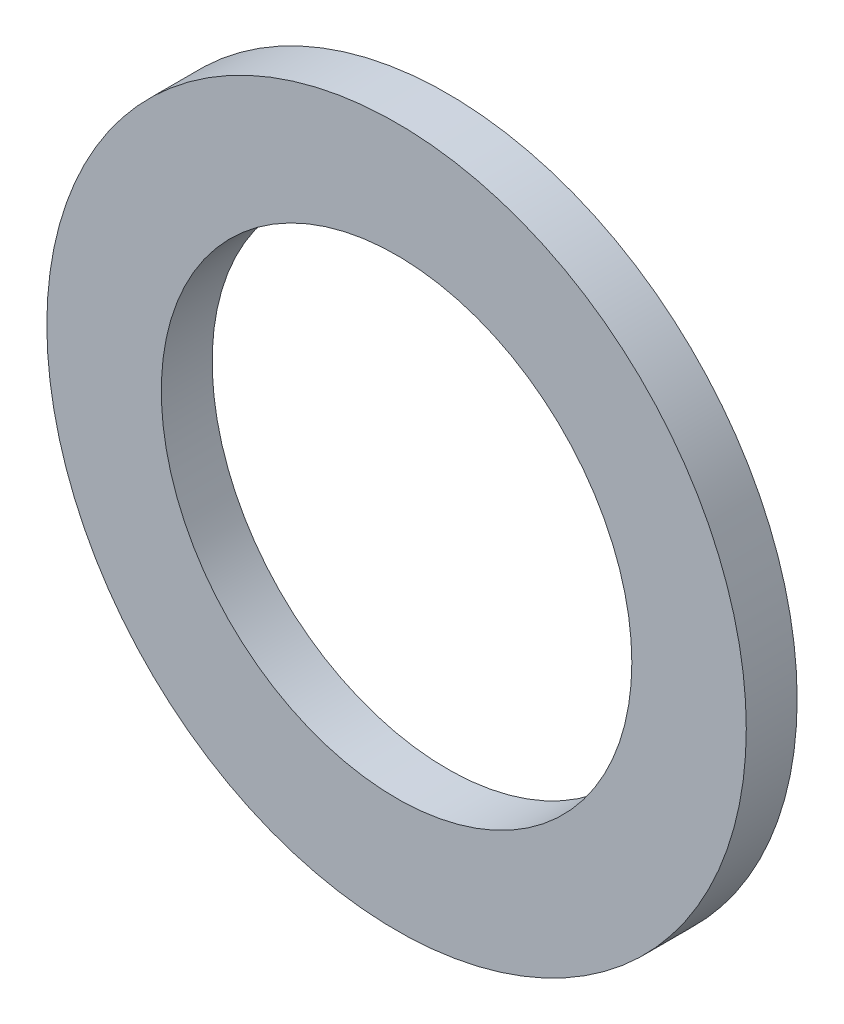
ISO-10303-21;
HEADER;
FILE_DESCRIPTION(('STEP AP214'),'2;1');
FILE_NAME('part.step','',(''),(''),'','','');
FILE_SCHEMA(('AUTOMOTIVE_DESIGN { 1 0 10303 214 1 1 1 1 }'));
ENDSEC;
DATA;
#1=APPLICATION_CONTEXT('core data for automotive mechanical design processes');
#2=APPLICATION_PROTOCOL_DEFINITION('international standard','automotive_design',2000,#1);
#3=PRODUCT_CONTEXT('',#1,'mechanical');
#4=PRODUCT('Part','Part','',(#3));
#5=PRODUCT_RELATED_PRODUCT_CATEGORY('part','',(#4));
#6=PRODUCT_DEFINITION_FORMATION('','',#4);
#7=PRODUCT_DEFINITION_CONTEXT('part definition',#1,'design');
#8=PRODUCT_DEFINITION('design','',#6,#7);
#9=PRODUCT_DEFINITION_SHAPE('','',#8);
#10=(LENGTH_UNIT() NAMED_UNIT(*) SI_UNIT(.MILLI.,.METRE.));
#11=(NAMED_UNIT(*) PLANE_ANGLE_UNIT() SI_UNIT($,.RADIAN.));
#12=(NAMED_UNIT(*) SI_UNIT($,.STERADIAN.) SOLID_ANGLE_UNIT());
#13=UNCERTAINTY_MEASURE_WITH_UNIT(LENGTH_MEASURE(1.E-05),#10,'distance_accuracy_value','');
#14=(GEOMETRIC_REPRESENTATION_CONTEXT(3) GLOBAL_UNCERTAINTY_ASSIGNED_CONTEXT((#13)) GLOBAL_UNIT_ASSIGNED_CONTEXT((#10,
#11,#12)) REPRESENTATION_CONTEXT('',''));
#15=CARTESIAN_POINT('',(0.,0.,0.));
#16=DIRECTION('',(0.,0.,1.));
#17=DIRECTION('',(1.,0.,0.));
#18=AXIS2_PLACEMENT_3D('',#15,#16,#17);
#19=CARTESIAN_POINT('',(-6.05342918884625,8.86394988366773,0.8));
#20=DIRECTION('',(0.,0.,1.));
#21=DIRECTION('',(1.,0.,0.));
#22=AXIS2_PLACEMENT_3D('',#19,#20,#21);
#23=PLANE('',#22);
#24=CARTESIAN_POINT('',(-6.05342918884625,8.86394988366773,0.8));
#25=DIRECTION('',(0.,0.,1.));
#26=DIRECTION('',(1.,0.,0.));
#27=AXIS2_PLACEMENT_3D('',#24,#25,#26);
#28=CIRCLE('',#27,5.5);
#29=CARTESIAN_POINT('',(-0.553429188846254,8.86394988366773,0.8));
#30=VERTEX_POINT('',#29);
#31=EDGE_CURVE('E10',#30,#30,#28,.T.);
#32=ORIENTED_EDGE('',*,*,#31,.T.);
#33=EDGE_LOOP('',(#32));
#34=FACE_BOUND('',#33,.T.);
#35=CARTESIAN_POINT('',(-6.05342918884625,8.86394988366773,0.8));
#36=DIRECTION('',(0.,0.,1.));
#37=DIRECTION('',(1.,0.,0.));
#38=AXIS2_PLACEMENT_3D('',#35,#36,#37);
#39=CIRCLE('',#38,3.7);
#40=CARTESIAN_POINT('',(-2.35342918884625,8.86394988366773,0.8));
#41=VERTEX_POINT('',#40);
#42=EDGE_CURVE('E49',#41,#41,#39,.T.);
#43=ORIENTED_EDGE('',*,*,#42,.F.);
#44=EDGE_LOOP('',(#43));
#45=FACE_BOUND('',#44,.T.);
#46=ADVANCED_FACE('F39',(#34,#45),#23,.T.);
#47=CARTESIAN_POINT('',(-6.05342918884625,8.86394988366773,0.));
#48=DIRECTION('',(0.,0.,1.));
#49=DIRECTION('',(1.,0.,0.));
#50=AXIS2_PLACEMENT_3D('',#47,#48,#49);
#51=PLANE('',#50);
#52=CARTESIAN_POINT('',(-6.05342918884625,8.86394988366773,0.));
#53=DIRECTION('',(0.,0.,1.));
#54=DIRECTION('',(1.,0.,0.));
#55=AXIS2_PLACEMENT_3D('',#52,#53,#54);
#56=CIRCLE('',#55,5.5);
#57=CARTESIAN_POINT('',(-0.553429188846254,8.86394988366773,0.));
#58=VERTEX_POINT('',#57);
#59=EDGE_CURVE('E43',#58,#58,#56,.T.);
#60=ORIENTED_EDGE('',*,*,#59,.F.);
#61=EDGE_LOOP('',(#60));
#62=FACE_BOUND('',#61,.T.);
#63=CARTESIAN_POINT('',(-6.05342918884625,8.86394988366773,0.));
#64=DIRECTION('',(0.,0.,1.));
#65=DIRECTION('',(1.,0.,0.));
#66=AXIS2_PLACEMENT_3D('',#63,#64,#65);
#67=CIRCLE('',#66,3.7);
#68=CARTESIAN_POINT('',(-2.35342918884625,8.86394988366773,0.));
#69=VERTEX_POINT('',#68);
#70=EDGE_CURVE('E55',#69,#69,#67,.T.);
#71=ORIENTED_EDGE('',*,*,#70,.T.);
#72=EDGE_LOOP('',(#71));
#73=FACE_BOUND('',#72,.T.);
#74=ADVANCED_FACE('F61',(#62,#73),#51,.F.);
#75=CARTESIAN_POINT('',(-6.05342918884625,8.86394988366773,0.8));
#76=DIRECTION('',(0.,0.,-1.));
#77=DIRECTION('',(-1.,0.,0.));
#78=AXIS2_PLACEMENT_3D('',#75,#76,#77);
#79=CYLINDRICAL_SURFACE('',#78,5.5);
#80=ORIENTED_EDGE('',*,*,#31,.F.);
#81=EDGE_LOOP('',(#80));
#82=FACE_BOUND('',#81,.T.);
#83=ORIENTED_EDGE('',*,*,#59,.T.);
#84=EDGE_LOOP('',(#83));
#85=FACE_BOUND('',#84,.T.);
#86=ADVANCED_FACE('F41',(#82,#85),#79,.T.);
#87=CARTESIAN_POINT('',(-6.05342918884625,8.86394988366773,0.8));
#88=DIRECTION('',(0.,0.,-1.));
#89=DIRECTION('',(-1.,0.,0.));
#90=AXIS2_PLACEMENT_3D('',#87,#88,#89);
#91=CYLINDRICAL_SURFACE('',#90,3.7);
#92=ORIENTED_EDGE('',*,*,#42,.T.);
#93=EDGE_LOOP('',(#92));
#94=FACE_BOUND('',#93,.T.);
#95=ORIENTED_EDGE('',*,*,#70,.F.);
#96=EDGE_LOOP('',(#95));
#97=FACE_BOUND('',#96,.T.);
#98=ADVANCED_FACE('F59',(#94,#97),#91,.F.);
#99=CLOSED_SHELL('',(#46,#74,#86,#98));
#100=MANIFOLD_SOLID_BREP('B2',#99);
#101=ADVANCED_BREP_SHAPE_REPRESENTATION('',(#18,#100),#14);
#102=SHAPE_DEFINITION_REPRESENTATION(#9,#101);
ENDSEC;
END-ISO-10303-21;
